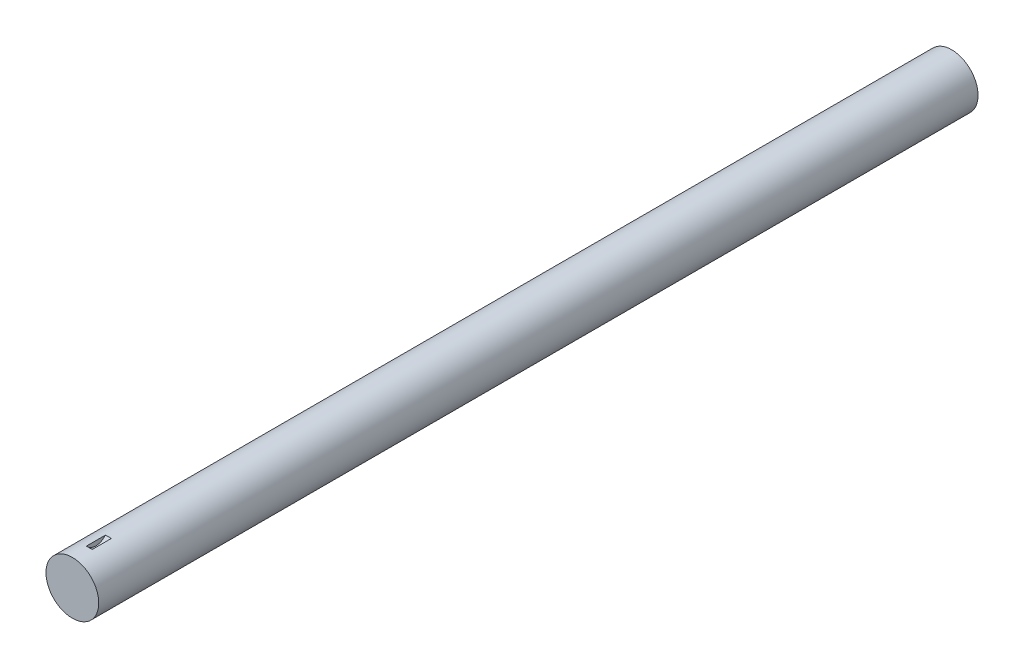
ISO-10303-21;
HEADER;
FILE_DESCRIPTION(('STEP AP214'),'2;1');
FILE_NAME('part.step','',(''),(''),'','','');
FILE_SCHEMA(('AUTOMOTIVE_DESIGN { 1 0 10303 214 1 1 1 1 }'));
ENDSEC;
DATA;
#1=APPLICATION_CONTEXT('core data for automotive mechanical design processes');
#2=APPLICATION_PROTOCOL_DEFINITION('international standard','automotive_design',2000,#1);
#3=PRODUCT_CONTEXT('',#1,'mechanical');
#4=PRODUCT('Part','Part','',(#3));
#5=PRODUCT_RELATED_PRODUCT_CATEGORY('part','',(#4));
#6=PRODUCT_DEFINITION_FORMATION('','',#4);
#7=PRODUCT_DEFINITION_CONTEXT('part definition',#1,'design');
#8=PRODUCT_DEFINITION('design','',#6,#7);
#9=PRODUCT_DEFINITION_SHAPE('','',#8);
#10=(LENGTH_UNIT() NAMED_UNIT(*) SI_UNIT(.MILLI.,.METRE.));
#11=(NAMED_UNIT(*) PLANE_ANGLE_UNIT() SI_UNIT($,.RADIAN.));
#12=(NAMED_UNIT(*) SI_UNIT($,.STERADIAN.) SOLID_ANGLE_UNIT());
#13=UNCERTAINTY_MEASURE_WITH_UNIT(LENGTH_MEASURE(1.E-05),#10,'distance_accuracy_value','');
#14=(GEOMETRIC_REPRESENTATION_CONTEXT(3) GLOBAL_UNCERTAINTY_ASSIGNED_CONTEXT((#13)) GLOBAL_UNIT_ASSIGNED_CONTEXT((#10,
#11,#12)) REPRESENTATION_CONTEXT('',''));
#15=CARTESIAN_POINT('',(0.,0.,0.));
#16=DIRECTION('',(0.,0.,1.));
#17=DIRECTION('',(1.,0.,0.));
#18=AXIS2_PLACEMENT_3D('',#15,#16,#17);
#19=CARTESIAN_POINT('',(0.,0.,50.));
#20=DIRECTION('',(0.,0.,-1.));
#21=DIRECTION('',(-1.,0.,0.));
#22=AXIS2_PLACEMENT_3D('',#19,#20,#21);
#23=CYLINDRICAL_SURFACE('',#22,9.);
#24=CARTESIAN_POINT('',(0.,0.,50.));
#25=DIRECTION('',(0.,0.,1.));
#26=DIRECTION('',(1.,0.,0.));
#27=AXIS2_PLACEMENT_3D('',#24,#25,#26);
#28=CIRCLE('',#27,9.);
#29=CARTESIAN_POINT('',(9.,0.,50.));
#30=VERTEX_POINT('',#29);
#31=EDGE_CURVE('E72',#30,#30,#28,.T.);
#32=ORIENTED_EDGE('',*,*,#31,.F.);
#33=EDGE_LOOP('',(#32));
#34=FACE_BOUND('',#33,.T.);
#35=DIRECTION('',(0.,0.,-1.));
#36=VECTOR('',#35,1.);
#37=CARTESIAN_POINT('',(-1.,8.94427190999916,50.));
#38=LINE('',#37,#36);
#39=CARTESIAN_POINT('',(-1.,8.94427190999916,37.7645318839493));
#40=VERTEX_POINT('',#39);
#41=CARTESIAN_POINT('',(-1.,8.94427190999916,44.2354681160507));
#42=VERTEX_POINT('',#41);
#43=EDGE_CURVE('E11',#40,#42,#38,.F.);
#44=ORIENTED_EDGE('',*,*,#43,.F.);
#45=CARTESIAN_POINT('',(-1.,8.94427190999916,37.7645318839493));
#46=CARTESIAN_POINT('',(-0.917014660448373,8.95355057552076,37.7572060235897));
#47=CARTESIAN_POINT('',(-0.833823559814697,8.9616815105628,37.7508442615649));
#48=CARTESIAN_POINT('',(-0.667127913914038,8.97563001244998,37.7399940884995));
#49=CARTESIAN_POINT('',(-0.583623377074169,8.98144764104778,37.735505627452));
#50=CARTESIAN_POINT('',(-0.333629398820489,8.99535710280745,37.7248037834322));
#51=CARTESIAN_POINT('',(-0.166814699410245,9.,37.721280737849));
#52=CARTESIAN_POINT('',(0.166814699410244,9.,37.721280737849));
#53=CARTESIAN_POINT('',(0.333629398820489,8.99535710280745,37.7248037834322));
#54=CARTESIAN_POINT('',(0.583623377074169,8.98144764104778,37.735505627452));
#55=CARTESIAN_POINT('',(0.667127913914038,8.97563001244998,37.7399940884995));
#56=CARTESIAN_POINT('',(0.833823559814697,8.9616815105628,37.7508442615649));
#57=CARTESIAN_POINT('',(0.917014660448373,8.95355057552076,37.7572060235897));
#58=CARTESIAN_POINT('',(1.,8.94427190999916,37.7645318839493));
#59=B_SPLINE_CURVE_WITH_KNOTS('',3,(#45,#46,#47,#48,#49,#50,#51,#52,#53,#54,#55,#56,#57,#58),
.UNSPECIFIED.,.F.,.F.,(4,2,2,2,2,2,4),(0.,0.251441421166999,0.502876129769366,1.00319150629433,
1.5035068828193,1.75494159142167,2.00638301258867),.UNSPECIFIED.);
#60=CARTESIAN_POINT('',(1.,8.94427190999916,37.7645318839493));
#61=VERTEX_POINT('',#60);
#62=EDGE_CURVE('E49',#40,#61,#59,.T.);
#63=ORIENTED_EDGE('',*,*,#62,.T.);
#64=DIRECTION('',(0.,0.,-1.));
#65=VECTOR('',#64,1.);
#66=CARTESIAN_POINT('',(1.,8.94427190999916,50.));
#67=LINE('',#66,#65);
#68=CARTESIAN_POINT('',(1.,8.94427190999916,44.2354681160507));
#69=VERTEX_POINT('',#68);
#70=EDGE_CURVE('E67',#61,#69,#67,.F.);
#71=ORIENTED_EDGE('',*,*,#70,.T.);
#72=CARTESIAN_POINT('',(1.,8.94427190999916,44.2354681160507));
#73=CARTESIAN_POINT('',(0.917014660448373,8.95355057552076,44.2427939764103));
#74=CARTESIAN_POINT('',(0.833823559814697,8.9616815105628,44.2491557384351));
#75=CARTESIAN_POINT('',(0.667127913914038,8.97563001244998,44.2600059115005));
#76=CARTESIAN_POINT('',(0.583623377074169,8.98144764104778,44.264494372548));
#77=CARTESIAN_POINT('',(0.333629398820489,8.99535710280745,44.2751962165679));
#78=CARTESIAN_POINT('',(0.166814699410245,9.,44.278719262151));
#79=CARTESIAN_POINT('',(-0.166814699410244,9.,44.278719262151));
#80=CARTESIAN_POINT('',(-0.333629398820489,8.99535710280745,44.2751962165679));
#81=CARTESIAN_POINT('',(-0.583623377074169,8.98144764104778,44.264494372548));
#82=CARTESIAN_POINT('',(-0.667127913914038,8.97563001244998,44.2600059115005));
#83=CARTESIAN_POINT('',(-0.833823559814697,8.9616815105628,44.2491557384351));
#84=CARTESIAN_POINT('',(-0.917014660448373,8.95355057552076,44.2427939764103));
#85=CARTESIAN_POINT('',(-1.,8.94427190999916,44.2354681160507));
#86=B_SPLINE_CURVE_WITH_KNOTS('',3,(#72,#73,#74,#75,#76,#77,#78,#79,#80,#81,#82,#83,#84,#85),
.UNSPECIFIED.,.F.,.F.,(4,2,2,2,2,2,4),(0.,0.251441421166999,0.502876129769366,1.00319150629433,
1.5035068828193,1.75494159142167,2.00638301258867),.UNSPECIFIED.);
#87=EDGE_CURVE('E71',#69,#42,#86,.T.);
#88=ORIENTED_EDGE('',*,*,#87,.T.);
#89=EDGE_LOOP('',(#44,#63,#71,#88));
#90=FACE_BOUND('',#89,.T.);
#91=CARTESIAN_POINT('',(0.,0.,-250.));
#92=DIRECTION('',(0.,0.,-1.));
#93=DIRECTION('',(-1.,0.,0.));
#94=AXIS2_PLACEMENT_3D('',#91,#92,#93);
#95=CIRCLE('',#94,9.);
#96=CARTESIAN_POINT('',(-9.,0.,-250.));
#97=VERTEX_POINT('',#96);
#98=EDGE_CURVE('E76',#97,#97,#95,.T.);
#99=ORIENTED_EDGE('',*,*,#98,.F.);
#100=EDGE_LOOP('',(#99));
#101=FACE_BOUND('',#100,.T.);
#102=ADVANCED_FACE('F41',(#34,#90,#101),#23,.T.);
#103=CARTESIAN_POINT('',(0.,0.,50.));
#104=DIRECTION('',(0.,0.,1.));
#105=DIRECTION('',(1.,0.,0.));
#106=AXIS2_PLACEMENT_3D('',#103,#104,#105);
#107=PLANE('',#106);
#108=ORIENTED_EDGE('',*,*,#31,.T.);
#109=EDGE_LOOP('',(#108));
#110=FACE_BOUND('',#109,.T.);
#111=ADVANCED_FACE('F94',(#110),#107,.T.);
#112=CARTESIAN_POINT('',(-1.,11.5,41.));
#113=DIRECTION('',(1.,0.,0.));
#114=DIRECTION('',(0.,0.,-1.));
#115=AXIS2_PLACEMENT_3D('',#112,#113,#114);
#116=CYLINDRICAL_SURFACE('',#115,4.12310562561766);
#117=CARTESIAN_POINT('',(-1.,11.5,41.));
#118=DIRECTION('',(1.,0.,0.));
#119=DIRECTION('',(0.,0.,-1.));
#120=AXIS2_PLACEMENT_3D('',#117,#118,#119);
#121=CIRCLE('',#120,4.12310562561766);
#122=EDGE_CURVE('E75',#42,#40,#121,.T.);
#123=ORIENTED_EDGE('',*,*,#122,.F.);
#124=ORIENTED_EDGE('',*,*,#87,.F.);
#125=CARTESIAN_POINT('',(1.,11.5,41.));
#126=DIRECTION('',(1.,0.,0.));
#127=DIRECTION('',(0.,0.,-1.));
#128=AXIS2_PLACEMENT_3D('',#125,#126,#127);
#129=CIRCLE('',#128,4.12310562561766);
#130=EDGE_CURVE('E55',#69,#61,#129,.T.);
#131=ORIENTED_EDGE('',*,*,#130,.T.);
#132=ORIENTED_EDGE('',*,*,#62,.F.);
#133=EDGE_LOOP('',(#123,#124,#131,#132));
#134=FACE_BOUND('',#133,.T.);
#135=ADVANCED_FACE('F74',(#134),#116,.F.);
#136=CARTESIAN_POINT('',(-1.,11.5,41.));
#137=DIRECTION('',(1.,0.,0.));
#138=DIRECTION('',(0.,0.,-1.));
#139=AXIS2_PLACEMENT_3D('',#136,#137,#138);
#140=PLANE('',#139);
#141=ORIENTED_EDGE('',*,*,#43,.T.);
#142=ORIENTED_EDGE('',*,*,#122,.T.);
#143=EDGE_LOOP('',(#141,#142));
#144=FACE_BOUND('',#143,.T.);
#145=ADVANCED_FACE('F93',(#144),#140,.T.);
#146=CARTESIAN_POINT('',(1.,11.5,41.));
#147=DIRECTION('',(1.,0.,0.));
#148=DIRECTION('',(0.,0.,-1.));
#149=AXIS2_PLACEMENT_3D('',#146,#147,#148);
#150=PLANE('',#149);
#151=ORIENTED_EDGE('',*,*,#130,.F.);
#152=ORIENTED_EDGE('',*,*,#70,.F.);
#153=EDGE_LOOP('',(#151,#152));
#154=FACE_BOUND('',#153,.T.);
#155=ADVANCED_FACE('F68',(#154),#150,.F.);
#156=CARTESIAN_POINT('',(0.,0.,-250.));
#157=DIRECTION('',(0.,0.,-1.));
#158=DIRECTION('',(-1.,0.,0.));
#159=AXIS2_PLACEMENT_3D('',#156,#157,#158);
#160=PLANE('',#159);
#161=ORIENTED_EDGE('',*,*,#98,.T.);
#162=EDGE_LOOP('',(#161));
#163=FACE_BOUND('',#162,.T.);
#164=ADVANCED_FACE('F111',(#163),#160,.T.);
#165=CLOSED_SHELL('',(#102,#111,#135,#145,#155,#164));
#166=MANIFOLD_SOLID_BREP('B2',#165);
#167=ADVANCED_BREP_SHAPE_REPRESENTATION('',(#18,#166),#14);
#168=SHAPE_DEFINITION_REPRESENTATION(#9,#167);
ENDSEC;
END-ISO-10303-21;
